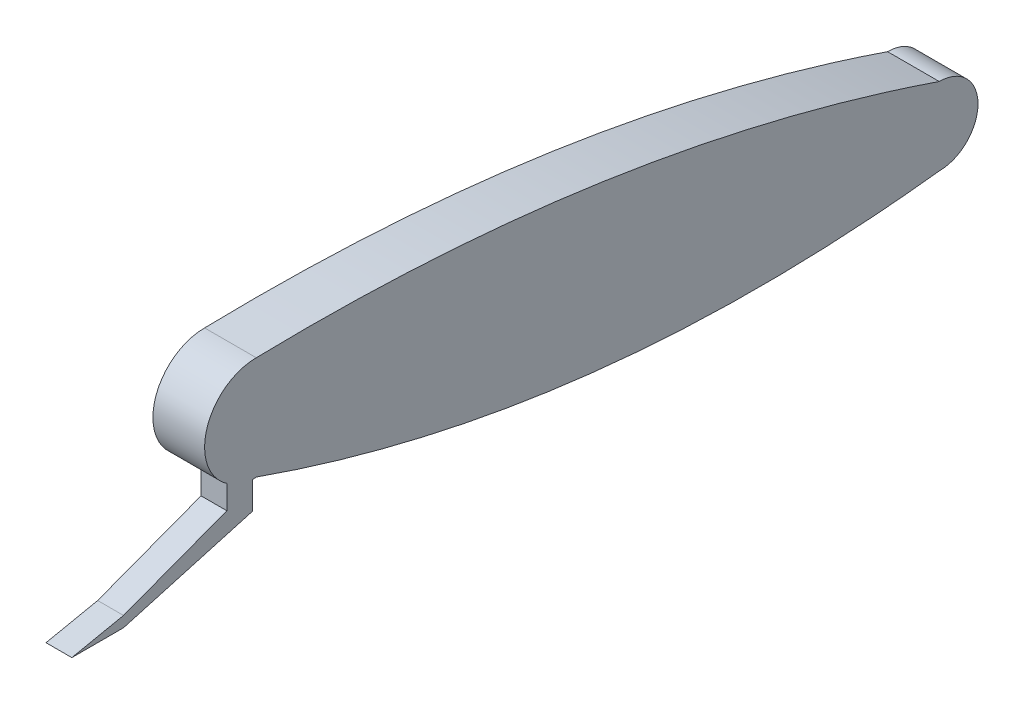
ISO-10303-21;
HEADER;
FILE_DESCRIPTION(('STEP AP214'),'2;1');
FILE_NAME('part.step','',(''),(''),'','','');
FILE_SCHEMA(('AUTOMOTIVE_DESIGN { 1 0 10303 214 1 1 1 1 }'));
ENDSEC;
DATA;
#1=APPLICATION_CONTEXT('core data for automotive mechanical design processes');
#2=APPLICATION_PROTOCOL_DEFINITION('international standard','automotive_design',2000,#1);
#3=PRODUCT_CONTEXT('',#1,'mechanical');
#4=PRODUCT('Part','Part','',(#3));
#5=PRODUCT_RELATED_PRODUCT_CATEGORY('part','',(#4));
#6=PRODUCT_DEFINITION_FORMATION('','',#4);
#7=PRODUCT_DEFINITION_CONTEXT('part definition',#1,'design');
#8=PRODUCT_DEFINITION('design','',#6,#7);
#9=PRODUCT_DEFINITION_SHAPE('','',#8);
#10=(LENGTH_UNIT() NAMED_UNIT(*) SI_UNIT(.MILLI.,.METRE.));
#11=(NAMED_UNIT(*) PLANE_ANGLE_UNIT() SI_UNIT($,.RADIAN.));
#12=(NAMED_UNIT(*) SI_UNIT($,.STERADIAN.) SOLID_ANGLE_UNIT());
#13=UNCERTAINTY_MEASURE_WITH_UNIT(LENGTH_MEASURE(1.E-05),#10,'distance_accuracy_value','');
#14=(GEOMETRIC_REPRESENTATION_CONTEXT(3) GLOBAL_UNCERTAINTY_ASSIGNED_CONTEXT((#13)) GLOBAL_UNIT_ASSIGNED_CONTEXT((#10,
#11,#12)) REPRESENTATION_CONTEXT('',''));
#15=CARTESIAN_POINT('',(0.,0.,0.));
#16=DIRECTION('',(0.,0.,1.));
#17=DIRECTION('',(1.,0.,0.));
#18=AXIS2_PLACEMENT_3D('',#15,#16,#17);
#19=CARTESIAN_POINT('',(270.,-15.4290868359324,-102.702838988307));
#20=DIRECTION('',(-1.,0.,0.));
#21=DIRECTION('',(0.,0.,1.));
#22=AXIS2_PLACEMENT_3D('',#19,#20,#21);
#23=PLANE('',#22);
#24=CARTESIAN_POINT('',(270.,70.,204.530172590958));
#25=CARTESIAN_POINT('',(270.,73.2413913882976,65.5595478654341));
#26=CARTESIAN_POINT('',(270.,30.4271590519452,-59.8197761746242));
#27=B_SPLINE_CURVE_WITH_KNOTS('',2,(#24,#25,#26),.UNSPECIFIED.,.F.,.F.,(3,3),(0.,
0.651255101531477),.UNSPECIFIED.);
#28=CARTESIAN_POINT('',(270.,70.,204.530172590958));
#29=VERTEX_POINT('',#28);
#30=CARTESIAN_POINT('',(270.,30.4271590519452,-59.8197761746242));
#31=VERTEX_POINT('',#30);
#32=EDGE_CURVE('E171',#29,#31,#27,.T.);
#33=ORIENTED_EDGE('',*,*,#32,.T.);
#34=CARTESIAN_POINT('',(270.,15.4271590519451,-59.8197761746242));
#35=DIRECTION('',(1.,0.,0.));
#36=DIRECTION('',(0.,0.,-1.));
#37=AXIS2_PLACEMENT_3D('',#34,#35,#36);
#38=CIRCLE('',#37,15.);
#39=CARTESIAN_POINT('',(270.,0.427159051945149,-59.8197761746242));
#40=VERTEX_POINT('',#39);
#41=EDGE_CURVE('E210',#40,#31,#38,.T.);
#42=ORIENTED_EDGE('',*,*,#41,.F.);
#43=CARTESIAN_POINT('',(270.,30.,204.530172590958));
#44=CARTESIAN_POINT('',(270.,-15.4206464424703,75.8072433384695));
#45=CARTESIAN_POINT('',(270.,0.427159051945149,-59.8197761746242));
#46=B_SPLINE_CURVE_WITH_KNOTS('',2,(#43,#44,#45),.UNSPECIFIED.,.F.,.F.,(3,3),(0.,1.),.UNSPECIFIED.);
#47=CARTESIAN_POINT('',(270.,30.,204.530172590958));
#48=VERTEX_POINT('',#47);
#49=EDGE_CURVE('E205',#48,#40,#46,.T.);
#50=ORIENTED_EDGE('',*,*,#49,.F.);
#51=CARTESIAN_POINT('',(270.,50.,204.530172590958));
#52=DIRECTION('',(1.,0.,0.));
#53=DIRECTION('',(0.,0.,-1.));
#54=AXIS2_PLACEMENT_3D('',#51,#52,#53);
#55=CIRCLE('',#54,20.);
#56=EDGE_CURVE('E179',#29,#48,#55,.T.);
#57=ORIENTED_EDGE('',*,*,#56,.F.);
#58=EDGE_LOOP('',(#33,#42,#50,#57));
#59=FACE_BOUND('',#58,.T.);
#60=ADVANCED_FACE('F41',(#59),#23,.T.);
#61=CARTESIAN_POINT('',(280.,0.,205.915324710576));
#62=DIRECTION('',(0.,0.,-1.));
#63=DIRECTION('',(1.,0.,0.));
#64=AXIS2_PLACEMENT_3D('',#61,#62,#63);
#65=PLANE('',#64);
#66=DIRECTION('',(0.,-1.,0.));
#67=VECTOR('',#66,1.);
#68=CARTESIAN_POINT('',(290.,0.,205.915324710576));
#69=LINE('',#68,#67);
#70=CARTESIAN_POINT('',(290.,29.8910872338557,205.915324710576));
#71=VERTEX_POINT('',#70);
#72=CARTESIAN_POINT('',(290.,19.2913568819967,205.915324710576));
#73=VERTEX_POINT('',#72);
#74=EDGE_CURVE('E149',#71,#73,#69,.T.);
#75=ORIENTED_EDGE('',*,*,#74,.T.);
#76=DIRECTION('',(1.,0.,0.));
#77=VECTOR('',#76,1.);
#78=CARTESIAN_POINT('',(280.,19.2913568819967,205.915324710576));
#79=LINE('',#78,#77);
#80=CARTESIAN_POINT('',(280.,19.2913568819967,205.915324710576));
#81=VERTEX_POINT('',#80);
#82=EDGE_CURVE('E156',#81,#73,#79,.T.);
#83=ORIENTED_EDGE('',*,*,#82,.F.);
#84=DIRECTION('',(0.,-1.,0.));
#85=VECTOR('',#84,1.);
#86=CARTESIAN_POINT('',(280.,0.,205.915324710576));
#87=LINE('',#86,#85);
#88=CARTESIAN_POINT('',(280.,29.8910872338557,205.915324710576));
#89=VERTEX_POINT('',#88);
#90=EDGE_CURVE('E133',#89,#81,#87,.T.);
#91=ORIENTED_EDGE('',*,*,#90,.F.);
#92=DIRECTION('',(1.,0.,0.));
#93=VECTOR('',#92,1.);
#94=CARTESIAN_POINT('',(280.,29.8910872338557,205.915324710576));
#95=LINE('',#94,#93);
#96=EDGE_CURVE('E93',#89,#71,#95,.T.);
#97=ORIENTED_EDGE('',*,*,#96,.T.);
#98=EDGE_LOOP('',(#75,#83,#91,#97));
#99=FACE_BOUND('',#98,.T.);
#100=ADVANCED_FACE('F297',(#99),#65,.T.);
#101=CARTESIAN_POINT('',(280.,71.7170143049613,20.2505368199647));
#102=DIRECTION('',(0.,-0.962370186764023,-0.271741832679068));
#103=DIRECTION('',(0.,0.271741832679068,-0.962370186764023));
#104=AXIS2_PLACEMENT_3D('',#101,#102,#103);
#105=PLANE('',#104);
#106=DIRECTION('',(0.,-0.271741832679068,0.962370186764023));
#107=VECTOR('',#106,1.);
#108=CARTESIAN_POINT('',(290.,71.7170143049613,20.2505368199647));
#109=LINE('',#108,#107);
#110=CARTESIAN_POINT('',(290.,5.17299388527913,255.915324710576));
#111=VERTEX_POINT('',#110);
#112=EDGE_CURVE('E122',#73,#111,#109,.T.);
#113=ORIENTED_EDGE('',*,*,#112,.T.);
#114=DIRECTION('',(1.,0.,0.));
#115=VECTOR('',#114,1.);
#116=CARTESIAN_POINT('',(280.,5.17299388527913,255.915324710576));
#117=LINE('',#116,#115);
#118=CARTESIAN_POINT('',(280.,5.17299388527913,255.915324710576));
#119=VERTEX_POINT('',#118);
#120=EDGE_CURVE('E114',#119,#111,#117,.T.);
#121=ORIENTED_EDGE('',*,*,#120,.F.);
#122=DIRECTION('',(0.,-0.271741832679068,0.962370186764023));
#123=VECTOR('',#122,1.);
#124=CARTESIAN_POINT('',(280.,71.7170143049613,20.2505368199647));
#125=LINE('',#124,#123);
#126=EDGE_CURVE('E136',#81,#119,#125,.T.);
#127=ORIENTED_EDGE('',*,*,#126,.F.);
#128=ORIENTED_EDGE('',*,*,#82,.T.);
#129=EDGE_LOOP('',(#113,#121,#127,#128));
#130=FACE_BOUND('',#129,.T.);
#131=ADVANCED_FACE('F300',(#130),#105,.T.);
#132=CARTESIAN_POINT('',(280.,5.17299388527916,0.));
#133=DIRECTION('',(0.,-1.,0.));
#134=DIRECTION('',(0.,0.,-1.));
#135=AXIS2_PLACEMENT_3D('',#132,#133,#134);
#136=PLANE('',#135);
#137=DIRECTION('',(0.,0.,1.));
#138=VECTOR('',#137,1.);
#139=CARTESIAN_POINT('',(290.,5.17299388527916,0.));
#140=LINE('',#139,#138);
#141=CARTESIAN_POINT('',(290.,5.17299388527913,275.915324710576));
#142=VERTEX_POINT('',#141);
#143=EDGE_CURVE('E119',#111,#142,#140,.T.);
#144=ORIENTED_EDGE('',*,*,#143,.T.);
#145=DIRECTION('',(1.,0.,0.));
#146=VECTOR('',#145,1.);
#147=CARTESIAN_POINT('',(280.,5.17299388527913,275.915324710576));
#148=LINE('',#147,#146);
#149=CARTESIAN_POINT('',(280.,5.17299388527913,275.915324710576));
#150=VERTEX_POINT('',#149);
#151=EDGE_CURVE('E104',#150,#142,#148,.T.);
#152=ORIENTED_EDGE('',*,*,#151,.F.);
#153=DIRECTION('',(0.,0.,1.));
#154=VECTOR('',#153,1.);
#155=CARTESIAN_POINT('',(280.,5.17299388527916,0.));
#156=LINE('',#155,#154);
#157=EDGE_CURVE('E137',#119,#150,#156,.T.);
#158=ORIENTED_EDGE('',*,*,#157,.F.);
#159=ORIENTED_EDGE('',*,*,#120,.T.);
#160=EDGE_LOOP('',(#144,#152,#158,#159));
#161=FACE_BOUND('',#160,.T.);
#162=ADVANCED_FACE('F120',(#161),#136,.T.);
#163=CARTESIAN_POINT('',(280.,59.788067823168,12.3909993520457));
#164=DIRECTION('',(0.,0.979191949917146,0.202936259001334));
#165=DIRECTION('',(0.,-0.202936259001334,0.979191949917146));
#166=AXIS2_PLACEMENT_3D('',#163,#164,#165);
#167=PLANE('',#166);
#168=DIRECTION('',(0.,0.202936259001334,-0.979191949917147));
#169=VECTOR('',#168,1.);
#170=CARTESIAN_POINT('',(290.,59.788067823168,12.3909993520457));
#171=LINE('',#170,#169);
#172=CARTESIAN_POINT('',(290.,9.31796789203042,255.915324710576));
#173=VERTEX_POINT('',#172);
#174=EDGE_CURVE('E109',#142,#173,#171,.T.);
#175=ORIENTED_EDGE('',*,*,#174,.T.);
#176=DIRECTION('',(1.,0.,0.));
#177=VECTOR('',#176,1.);
#178=CARTESIAN_POINT('',(280.,9.31796789203042,255.915324710576));
#179=LINE('',#178,#177);
#180=CARTESIAN_POINT('',(280.,9.31796789203042,255.915324710576));
#181=VERTEX_POINT('',#180);
#182=EDGE_CURVE('E81',#181,#173,#179,.T.);
#183=ORIENTED_EDGE('',*,*,#182,.F.);
#184=DIRECTION('',(0.,0.202936259001334,-0.979191949917147));
#185=VECTOR('',#184,1.);
#186=CARTESIAN_POINT('',(280.,59.788067823168,12.3909993520457));
#187=LINE('',#186,#185);
#188=EDGE_CURVE('E108',#150,#181,#187,.T.);
#189=ORIENTED_EDGE('',*,*,#188,.F.);
#190=ORIENTED_EDGE('',*,*,#151,.T.);
#191=EDGE_LOOP('',(#175,#183,#189,#190));
#192=FACE_BOUND('',#191,.T.);
#193=ADVANCED_FACE('F103',(#192),#167,.T.);
#194=CARTESIAN_POINT('',(280.,92.6607970919828,34.949327406955));
#195=DIRECTION('',(0.,-0.935658446998121,-0.352906886531086));
#196=DIRECTION('',(0.,0.352906886531086,-0.935658446998121));
#197=AXIS2_PLACEMENT_3D('',#194,#195,#196);
#198=PLANE('',#197);
#199=DIRECTION('',(0.,-0.352906886531086,0.935658446998121));
#200=VECTOR('',#199,1.);
#201=CARTESIAN_POINT('',(290.,92.6607970919828,34.949327406955));
#202=LINE('',#201,#200);
#203=CARTESIAN_POINT('',(290.,24.4049641207641,215.915324710576));
#204=VERTEX_POINT('',#203);
#205=EDGE_CURVE('E130',#204,#173,#202,.T.);
#206=ORIENTED_EDGE('',*,*,#205,.F.);
#207=DIRECTION('',(1.,0.,0.));
#208=VECTOR('',#207,1.);
#209=CARTESIAN_POINT('',(280.,24.4049641207641,215.915324710576));
#210=LINE('',#209,#208);
#211=CARTESIAN_POINT('',(280.,24.4049641207641,215.915324710576));
#212=VERTEX_POINT('',#211);
#213=EDGE_CURVE('E56',#212,#204,#210,.T.);
#214=ORIENTED_EDGE('',*,*,#213,.F.);
#215=DIRECTION('',(0.,-0.352906886531086,0.935658446998121));
#216=VECTOR('',#215,1.);
#217=CARTESIAN_POINT('',(280.,92.6607970919828,34.949327406955));
#218=LINE('',#217,#216);
#219=EDGE_CURVE('E145',#212,#181,#218,.T.);
#220=ORIENTED_EDGE('',*,*,#219,.T.);
#221=ORIENTED_EDGE('',*,*,#182,.T.);
#222=EDGE_LOOP('',(#206,#214,#220,#221));
#223=FACE_BOUND('',#222,.T.);
#224=ADVANCED_FACE('F314',(#223),#198,.F.);
#225=CARTESIAN_POINT('',(270.,15.4271590519451,-59.8197761746242));
#226=DIRECTION('',(1.,0.,0.));
#227=DIRECTION('',(0.,0.,1.));
#228=AXIS2_PLACEMENT_3D('',#225,#226,#227);
#229=CYLINDRICAL_SURFACE('',#228,15.);
#230=CARTESIAN_POINT('',(290.,15.4271590519451,-59.8197761746242));
#231=DIRECTION('',(1.,0.,0.));
#232=DIRECTION('',(0.,0.,-1.));
#233=AXIS2_PLACEMENT_3D('',#230,#231,#232);
#234=CIRCLE('',#233,15.);
#235=CARTESIAN_POINT('',(290.,0.427159051945149,-59.8197761746242));
#236=VERTEX_POINT('',#235);
#237=CARTESIAN_POINT('',(290.,30.4271590519452,-59.8197761746242));
#238=VERTEX_POINT('',#237);
#239=EDGE_CURVE('E177',#236,#238,#234,.T.);
#240=ORIENTED_EDGE('',*,*,#239,.F.);
#241=DIRECTION('',(1.,0.,0.));
#242=VECTOR('',#241,1.);
#243=CARTESIAN_POINT('',(270.,0.427159051945149,-59.8197761746242));
#244=LINE('',#243,#242);
#245=EDGE_CURVE('E237',#40,#236,#244,.T.);
#246=ORIENTED_EDGE('',*,*,#245,.F.);
#247=ORIENTED_EDGE('',*,*,#41,.T.);
#248=DIRECTION('',(1.,0.,0.));
#249=VECTOR('',#248,1.);
#250=CARTESIAN_POINT('',(270.,30.4271590519452,-59.8197761746242));
#251=LINE('',#250,#249);
#252=EDGE_CURVE('E215',#31,#238,#251,.T.);
#253=ORIENTED_EDGE('',*,*,#252,.T.);
#254=EDGE_LOOP('',(#240,#246,#247,#253));
#255=FACE_BOUND('',#254,.T.);
#256=ADVANCED_FACE('F198',(#255),#229,.T.);
#257=CARTESIAN_POINT('',(280.,39.8910872338557,205.915324710576));
#258=DIRECTION('',(1.,0.,0.));
#259=DIRECTION('',(0.,0.,1.));
#260=AXIS2_PLACEMENT_3D('',#257,#258,#259);
#261=CYLINDRICAL_SURFACE('',#260,10.);
#262=CARTESIAN_POINT('',(290.,39.8910872338557,205.915324710576));
#263=DIRECTION('',(1.,0.,0.));
#264=DIRECTION('',(0.,0.,-1.));
#265=AXIS2_PLACEMENT_3D('',#262,#263,#264);
#266=CIRCLE('',#265,10.);
#267=CARTESIAN_POINT('',(290.,29.9910607641754,204.504836887293));
#268=VERTEX_POINT('',#267);
#269=EDGE_CURVE('E11',#71,#268,#266,.T.);
#270=ORIENTED_EDGE('',*,*,#269,.F.);
#271=ORIENTED_EDGE('',*,*,#96,.F.);
#272=CARTESIAN_POINT('',(280.,39.8910872338557,205.915324710576));
#273=DIRECTION('',(1.,0.,0.));
#274=DIRECTION('',(0.,0.,-1.));
#275=AXIS2_PLACEMENT_3D('',#272,#273,#274);
#276=CIRCLE('',#275,10.);
#277=CARTESIAN_POINT('',(280.,29.9910607641754,204.504836887293));
#278=VERTEX_POINT('',#277);
#279=EDGE_CURVE('E42',#89,#278,#276,.T.);
#280=ORIENTED_EDGE('',*,*,#279,.T.);
#281=DIRECTION('',(1.,0.,0.));
#282=VECTOR('',#281,1.);
#283=CARTESIAN_POINT('',(270.,29.9910607641754,204.504836887293));
#284=LINE('',#283,#282);
#285=EDGE_CURVE('E168',#268,#278,#284,.F.);
#286=ORIENTED_EDGE('',*,*,#285,.F.);
#287=EDGE_LOOP('',(#270,#271,#280,#286));
#288=FACE_BOUND('',#287,.T.);
#289=ADVANCED_FACE('F259',(#288),#261,.T.);
#290=CARTESIAN_POINT('',(280.,0.,0.));
#291=DIRECTION('',(-1.,0.,0.));
#292=DIRECTION('',(0.,0.,-1.));
#293=AXIS2_PLACEMENT_3D('',#290,#291,#292);
#294=PLANE('',#293);
#295=CARTESIAN_POINT('',(280.,50.,204.530172590958));
#296=DIRECTION('',(1.,0.,0.));
#297=DIRECTION('',(0.,0.,-1.));
#298=AXIS2_PLACEMENT_3D('',#295,#296,#297);
#299=CIRCLE('',#298,20.);
#300=CARTESIAN_POINT('',(280.,33.5568156607919,215.915324710576));
#301=VERTEX_POINT('',#300);
#302=CARTESIAN_POINT('',(280.,30.,204.530172590958));
#303=VERTEX_POINT('',#302);
#304=EDGE_CURVE('E170',#301,#303,#299,.T.);
#305=ORIENTED_EDGE('',*,*,#304,.T.);
#306=CARTESIAN_POINT('',(280.,30.,204.530172590958));
#307=CARTESIAN_POINT('',(280.,-15.4206464424703,75.8072433384695));
#308=CARTESIAN_POINT('',(280.,0.427159051945149,-59.8197761746242));
#309=B_SPLINE_CURVE_WITH_KNOTS('',2,(#306,#307,#308),.UNSPECIFIED.,.F.,.F.,(3,3),(0.,1.),.UNSPECIFIED.);
#310=EDGE_CURVE('E243',#303,#278,#309,.T.);
#311=ORIENTED_EDGE('',*,*,#310,.T.);
#312=ORIENTED_EDGE('',*,*,#279,.F.);
#313=ORIENTED_EDGE('',*,*,#90,.T.);
#314=ORIENTED_EDGE('',*,*,#126,.T.);
#315=ORIENTED_EDGE('',*,*,#157,.T.);
#316=ORIENTED_EDGE('',*,*,#188,.T.);
#317=ORIENTED_EDGE('',*,*,#219,.F.);
#318=DIRECTION('',(0.,-1.,0.));
#319=VECTOR('',#318,1.);
#320=CARTESIAN_POINT('',(280.,0.,215.915324710576));
#321=LINE('',#320,#319);
#322=EDGE_CURVE('E142',#301,#212,#321,.T.);
#323=ORIENTED_EDGE('',*,*,#322,.F.);
#324=EDGE_LOOP('',(#305,#311,#312,#313,#314,#315,#316,#317,#323));
#325=FACE_BOUND('',#324,.T.);
#326=ADVANCED_FACE('F200',(#325),#294,.T.);
#327=DIRECTION('',(1.,0.,0.));
#328=VECTOR('',#327,1.);
#329=SURFACE_OF_LINEAR_EXTRUSION('',#46,#328);
#330=ORIENTED_EDGE('',*,*,#285,.T.);
#331=ORIENTED_EDGE('',*,*,#310,.F.);
#332=DIRECTION('',(1.,0.,0.));
#333=VECTOR('',#332,1.);
#334=CARTESIAN_POINT('',(270.,30.,204.530172590958));
#335=LINE('',#334,#333);
#336=EDGE_CURVE('E236',#48,#303,#335,.T.);
#337=ORIENTED_EDGE('',*,*,#336,.F.);
#338=ORIENTED_EDGE('',*,*,#49,.T.);
#339=ORIENTED_EDGE('',*,*,#245,.T.);
#340=CARTESIAN_POINT('',(290.,30.,204.530172590958));
#341=CARTESIAN_POINT('',(290.,-15.4206464424703,75.8072433384695));
#342=CARTESIAN_POINT('',(290.,0.427159051945149,-59.8197761746242));
#343=B_SPLINE_CURVE_WITH_KNOTS('',2,(#340,#341,#342),.UNSPECIFIED.,.F.,.F.,(3,3),(0.,1.),.UNSPECIFIED.);
#344=EDGE_CURVE('E224',#268,#236,#343,.T.);
#345=ORIENTED_EDGE('',*,*,#344,.F.);
#346=EDGE_LOOP('',(#330,#331,#337,#338,#339,#345));
#347=FACE_BOUND('',#346,.T.);
#348=ADVANCED_FACE('F188',(#347),#329,.T.);
#349=DIRECTION('',(1.,0.,0.));
#350=VECTOR('',#349,1.);
#351=SURFACE_OF_LINEAR_EXTRUSION('',#27,#350);
#352=CARTESIAN_POINT('',(290.,70.,204.530172590958));
#353=CARTESIAN_POINT('',(290.,73.2413913882976,65.5595478654341));
#354=CARTESIAN_POINT('',(290.,30.4271590519452,-59.8197761746242));
#355=B_SPLINE_CURVE_WITH_KNOTS('',2,(#352,#353,#354),.UNSPECIFIED.,.F.,.F.,(3,3),(0.,
0.651255101531477),.UNSPECIFIED.);
#356=CARTESIAN_POINT('',(290.,70.,204.530172590958));
#357=VERTEX_POINT('',#356);
#358=EDGE_CURVE('E175',#357,#238,#355,.T.);
#359=ORIENTED_EDGE('',*,*,#358,.T.);
#360=ORIENTED_EDGE('',*,*,#252,.F.);
#361=ORIENTED_EDGE('',*,*,#32,.F.);
#362=DIRECTION('',(1.,0.,0.));
#363=VECTOR('',#362,1.);
#364=CARTESIAN_POINT('',(270.,70.,204.530172590958));
#365=LINE('',#364,#363);
#366=EDGE_CURVE('E244',#29,#357,#365,.T.);
#367=ORIENTED_EDGE('',*,*,#366,.T.);
#368=EDGE_LOOP('',(#359,#360,#361,#367));
#369=FACE_BOUND('',#368,.T.);
#370=ADVANCED_FACE('F186',(#369),#351,.F.);
#371=CARTESIAN_POINT('',(290.,0.,0.));
#372=DIRECTION('',(-1.,0.,0.));
#373=DIRECTION('',(0.,0.,-1.));
#374=AXIS2_PLACEMENT_3D('',#371,#372,#373);
#375=PLANE('',#374);
#376=ORIENTED_EDGE('',*,*,#344,.T.);
#377=ORIENTED_EDGE('',*,*,#239,.T.);
#378=ORIENTED_EDGE('',*,*,#358,.F.);
#379=CARTESIAN_POINT('',(290.,50.,204.530172590958));
#380=DIRECTION('',(1.,0.,0.));
#381=DIRECTION('',(0.,0.,-1.));
#382=AXIS2_PLACEMENT_3D('',#379,#380,#381);
#383=CIRCLE('',#382,20.);
#384=CARTESIAN_POINT('',(290.,33.5568156607919,215.915324710576));
#385=VERTEX_POINT('',#384);
#386=EDGE_CURVE('E219',#357,#385,#383,.T.);
#387=ORIENTED_EDGE('',*,*,#386,.T.);
#388=DIRECTION('',(0.,-1.,0.));
#389=VECTOR('',#388,1.);
#390=CARTESIAN_POINT('',(290.,0.,215.915324710576));
#391=LINE('',#390,#389);
#392=EDGE_CURVE('E49',#385,#204,#391,.T.);
#393=ORIENTED_EDGE('',*,*,#392,.T.);
#394=ORIENTED_EDGE('',*,*,#205,.T.);
#395=ORIENTED_EDGE('',*,*,#174,.F.);
#396=ORIENTED_EDGE('',*,*,#143,.F.);
#397=ORIENTED_EDGE('',*,*,#112,.F.);
#398=ORIENTED_EDGE('',*,*,#74,.F.);
#399=ORIENTED_EDGE('',*,*,#269,.T.);
#400=EDGE_LOOP('',(#376,#377,#378,#387,#393,#394,#395,#396,#397,#398,#399));
#401=FACE_BOUND('',#400,.T.);
#402=ADVANCED_FACE('F124',(#401),#375,.F.);
#403=CARTESIAN_POINT('',(280.,0.,215.915324710576));
#404=DIRECTION('',(0.,0.,-1.));
#405=DIRECTION('',(1.,0.,0.));
#406=AXIS2_PLACEMENT_3D('',#403,#404,#405);
#407=PLANE('',#406);
#408=ORIENTED_EDGE('',*,*,#322,.T.);
#409=ORIENTED_EDGE('',*,*,#213,.T.);
#410=ORIENTED_EDGE('',*,*,#392,.F.);
#411=DIRECTION('',(1.,0.,0.));
#412=VECTOR('',#411,1.);
#413=CARTESIAN_POINT('',(270.,33.5568156607919,215.915324710576));
#414=LINE('',#413,#412);
#415=EDGE_CURVE('E165',#301,#385,#414,.T.);
#416=ORIENTED_EDGE('',*,*,#415,.F.);
#417=EDGE_LOOP('',(#408,#409,#410,#416));
#418=FACE_BOUND('',#417,.T.);
#419=ADVANCED_FACE('F191',(#418),#407,.F.);
#420=CARTESIAN_POINT('',(270.,50.,204.530172590958));
#421=DIRECTION('',(1.,0.,0.));
#422=DIRECTION('',(0.,0.,1.));
#423=AXIS2_PLACEMENT_3D('',#420,#421,#422);
#424=CYLINDRICAL_SURFACE('',#423,20.);
#425=ORIENTED_EDGE('',*,*,#415,.T.);
#426=ORIENTED_EDGE('',*,*,#386,.F.);
#427=ORIENTED_EDGE('',*,*,#366,.F.);
#428=ORIENTED_EDGE('',*,*,#56,.T.);
#429=ORIENTED_EDGE('',*,*,#336,.T.);
#430=ORIENTED_EDGE('',*,*,#304,.F.);
#431=EDGE_LOOP('',(#425,#426,#427,#428,#429,#430));
#432=FACE_BOUND('',#431,.T.);
#433=ADVANCED_FACE('F192',(#432),#424,.T.);
#434=CLOSED_SHELL('',(#60,#100,#131,#162,#193,#224,#256,#289,#326,#348,#370,#402,#419,#433));
#435=MANIFOLD_SOLID_BREP('B2',#434);
#436=ADVANCED_BREP_SHAPE_REPRESENTATION('',(#18,#435),#14);
#437=SHAPE_DEFINITION_REPRESENTATION(#9,#436);
ENDSEC;
END-ISO-10303-21;
